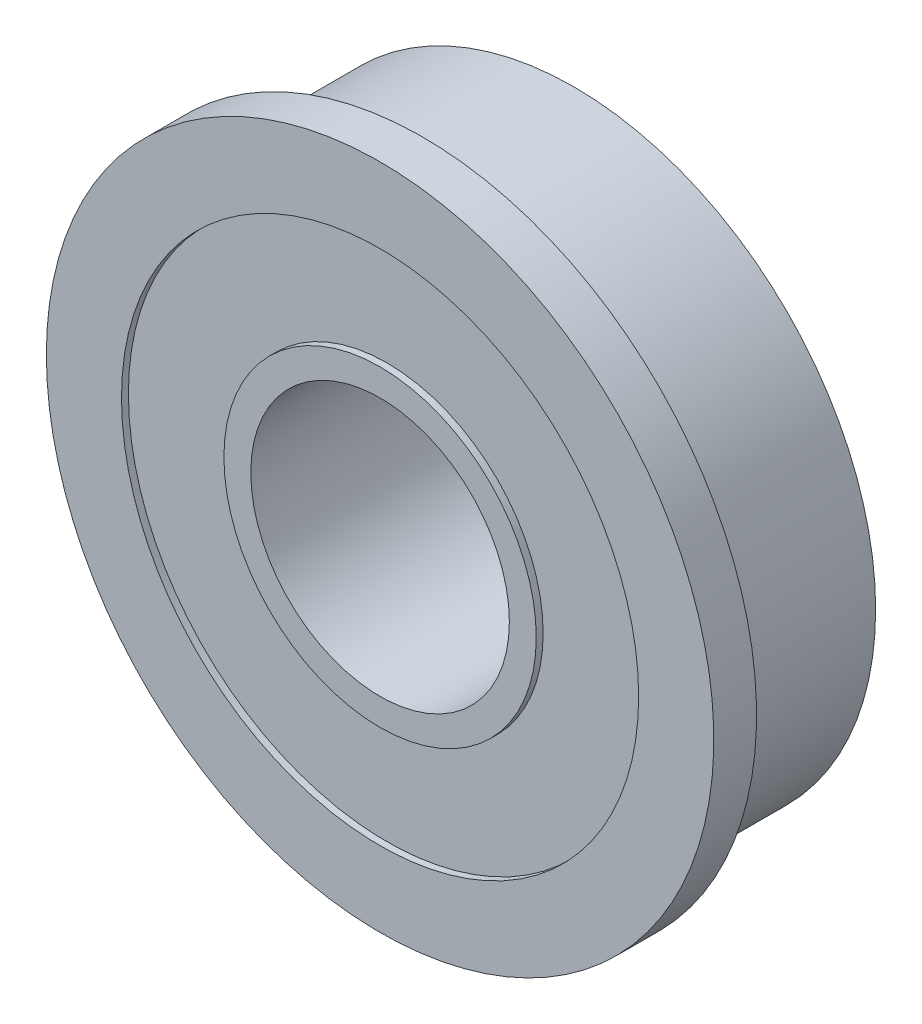
ISO-10303-21;
HEADER;
FILE_DESCRIPTION(('STEP AP214'),'2;1');
FILE_NAME('part.step','',(''),(''),'','','');
FILE_SCHEMA(('AUTOMOTIVE_DESIGN { 1 0 10303 214 1 1 1 1 }'));
ENDSEC;
DATA;
#1=APPLICATION_CONTEXT('core data for automotive mechanical design processes');
#2=APPLICATION_PROTOCOL_DEFINITION('international standard','automotive_design',2000,#1);
#3=PRODUCT_CONTEXT('',#1,'mechanical');
#4=PRODUCT('Part','Part','',(#3));
#5=PRODUCT_RELATED_PRODUCT_CATEGORY('part','',(#4));
#6=PRODUCT_DEFINITION_FORMATION('','',#4);
#7=PRODUCT_DEFINITION_CONTEXT('part definition',#1,'design');
#8=PRODUCT_DEFINITION('design','',#6,#7);
#9=PRODUCT_DEFINITION_SHAPE('','',#8);
#10=(LENGTH_UNIT() NAMED_UNIT(*) SI_UNIT(.MILLI.,.METRE.));
#11=(NAMED_UNIT(*) PLANE_ANGLE_UNIT() SI_UNIT($,.RADIAN.));
#12=(NAMED_UNIT(*) SI_UNIT($,.STERADIAN.) SOLID_ANGLE_UNIT());
#13=UNCERTAINTY_MEASURE_WITH_UNIT(LENGTH_MEASURE(1.E-05),#10,'distance_accuracy_value','');
#14=(GEOMETRIC_REPRESENTATION_CONTEXT(3) GLOBAL_UNCERTAINTY_ASSIGNED_CONTEXT((#13)) GLOBAL_UNIT_ASSIGNED_CONTEXT((#10,
#11,#12)) REPRESENTATION_CONTEXT('',''));
#15=CARTESIAN_POINT('',(0.,0.,0.));
#16=DIRECTION('',(0.,0.,1.));
#17=DIRECTION('',(1.,0.,0.));
#18=AXIS2_PLACEMENT_3D('',#15,#16,#17);
#19=CARTESIAN_POINT('',(4.7625,0.,3.57124));
#20=DIRECTION('',(0.,0.,-1.));
#21=DIRECTION('',(-1.,0.,0.));
#22=AXIS2_PLACEMENT_3D('',#19,#20,#21);
#23=PLANE('',#22);
#24=CARTESIAN_POINT('',(0.,0.,3.57124));
#25=DIRECTION('',(0.,0.,-1.));
#26=DIRECTION('',(-1.,0.,0.));
#27=AXIS2_PLACEMENT_3D('',#24,#25,#26);
#28=CIRCLE('',#27,4.7625);
#29=CARTESIAN_POINT('',(-4.7625,0.,3.57124));
#30=VERTEX_POINT('',#29);
#31=EDGE_CURVE('E57',#30,#30,#28,.T.);
#32=ORIENTED_EDGE('',*,*,#31,.T.);
#33=EDGE_LOOP('',(#32));
#34=FACE_BOUND('',#33,.T.);
#35=CARTESIAN_POINT('',(0.,0.,3.57124));
#36=DIRECTION('',(0.,0.,-1.));
#37=DIRECTION('',(-1.,0.,0.));
#38=AXIS2_PLACEMENT_3D('',#35,#36,#37);
#39=CIRCLE('',#38,5.7531);
#40=CARTESIAN_POINT('',(-5.7531,0.,3.57124));
#41=VERTEX_POINT('',#40);
#42=EDGE_CURVE('E17',#41,#41,#39,.T.);
#43=ORIENTED_EDGE('',*,*,#42,.F.);
#44=EDGE_LOOP('',(#43));
#45=FACE_BOUND('',#44,.T.);
#46=ADVANCED_FACE('F14',(#34,#45),#23,.F.);
#47=CARTESIAN_POINT('',(0.,0.,-3.57124));
#48=DIRECTION('',(0.,0.,-1.));
#49=DIRECTION('',(-1.,0.,0.));
#50=AXIS2_PLACEMENT_3D('',#47,#48,#49);
#51=CYLINDRICAL_SURFACE('',#50,5.7531);
#52=CARTESIAN_POINT('',(0.,0.,3.31724));
#53=DIRECTION('',(0.,0.,-1.));
#54=DIRECTION('',(-1.,0.,0.));
#55=AXIS2_PLACEMENT_3D('',#52,#53,#54);
#56=CIRCLE('',#55,5.7531);
#57=CARTESIAN_POINT('',(-5.7531,0.,3.31724));
#58=VERTEX_POINT('',#57);
#59=EDGE_CURVE('E55',#58,#58,#56,.F.);
#60=ORIENTED_EDGE('',*,*,#59,.T.);
#61=EDGE_LOOP('',(#60));
#62=FACE_BOUND('',#61,.T.);
#63=ORIENTED_EDGE('',*,*,#42,.T.);
#64=EDGE_LOOP('',(#63));
#65=FACE_BOUND('',#64,.T.);
#66=ADVANCED_FACE('F64',(#62,#65),#51,.T.);
#67=CARTESIAN_POINT('',(0.,0.,-3.57124));
#68=DIRECTION('',(0.,0.,-1.));
#69=DIRECTION('',(-1.,0.,0.));
#70=AXIS2_PLACEMENT_3D('',#67,#68,#69);
#71=CYLINDRICAL_SURFACE('',#70,4.7625);
#72=ORIENTED_EDGE('',*,*,#31,.F.);
#73=EDGE_LOOP('',(#72));
#74=FACE_BOUND('',#73,.T.);
#75=CARTESIAN_POINT('',(0.,0.,-3.57124));
#76=DIRECTION('',(0.,0.,-1.));
#77=DIRECTION('',(-1.,0.,0.));
#78=AXIS2_PLACEMENT_3D('',#75,#76,#77);
#79=CIRCLE('',#78,4.7625);
#80=CARTESIAN_POINT('',(-4.7625,0.,-3.57124));
#81=VERTEX_POINT('',#80);
#82=EDGE_CURVE('E52',#81,#81,#79,.T.);
#83=ORIENTED_EDGE('',*,*,#82,.T.);
#84=EDGE_LOOP('',(#83));
#85=FACE_BOUND('',#84,.T.);
#86=ADVANCED_FACE('F71',(#74,#85),#71,.F.);
#87=CARTESIAN_POINT('',(5.7531,0.,3.31724));
#88=DIRECTION('',(0.,0.,-1.));
#89=DIRECTION('',(-1.,0.,0.));
#90=AXIS2_PLACEMENT_3D('',#87,#88,#89);
#91=PLANE('',#90);
#92=ORIENTED_EDGE('',*,*,#59,.F.);
#93=EDGE_LOOP('',(#92));
#94=FACE_BOUND('',#93,.T.);
#95=CARTESIAN_POINT('',(0.,0.,3.31724));
#96=DIRECTION('',(0.,0.,-1.));
#97=DIRECTION('',(-1.,0.,0.));
#98=AXIS2_PLACEMENT_3D('',#95,#96,#97);
#99=CIRCLE('',#98,9.52499999999999);
#100=CARTESIAN_POINT('',(-9.52499999999999,0.,3.31724));
#101=VERTEX_POINT('',#100);
#102=EDGE_CURVE('E49',#101,#101,#99,.F.);
#103=ORIENTED_EDGE('',*,*,#102,.T.);
#104=EDGE_LOOP('',(#103));
#105=FACE_BOUND('',#104,.T.);
#106=ADVANCED_FACE('F115',(#94,#105),#91,.F.);
#107=CARTESIAN_POINT('',(5.7531,0.,-3.57124));
#108=DIRECTION('',(0.,0.,1.));
#109=DIRECTION('',(1.,0.,0.));
#110=AXIS2_PLACEMENT_3D('',#107,#108,#109);
#111=PLANE('',#110);
#112=CARTESIAN_POINT('',(0.,0.,-3.57124));
#113=DIRECTION('',(0.,0.,-1.));
#114=DIRECTION('',(-1.,0.,0.));
#115=AXIS2_PLACEMENT_3D('',#112,#113,#114);
#116=CIRCLE('',#115,5.7531);
#117=CARTESIAN_POINT('',(-5.7531,0.,-3.57124));
#118=VERTEX_POINT('',#117);
#119=EDGE_CURVE('E46',#118,#118,#116,.F.);
#120=ORIENTED_EDGE('',*,*,#119,.F.);
#121=EDGE_LOOP('',(#120));
#122=FACE_BOUND('',#121,.T.);
#123=ORIENTED_EDGE('',*,*,#82,.F.);
#124=EDGE_LOOP('',(#123));
#125=FACE_BOUND('',#124,.T.);
#126=ADVANCED_FACE('F111',(#122,#125),#111,.F.);
#127=CARTESIAN_POINT('',(0.,0.,-3.57124));
#128=DIRECTION('',(0.,0.,-1.));
#129=DIRECTION('',(-1.,0.,0.));
#130=AXIS2_PLACEMENT_3D('',#127,#128,#129);
#131=CYLINDRICAL_SURFACE('',#130,9.52499999999999);
#132=CARTESIAN_POINT('',(0.,0.,3.57124));
#133=DIRECTION('',(0.,0.,-1.));
#134=DIRECTION('',(-1.,0.,0.));
#135=AXIS2_PLACEMENT_3D('',#132,#133,#134);
#136=CIRCLE('',#135,9.52499999999999);
#137=CARTESIAN_POINT('',(-9.52499999999999,0.,3.57124));
#138=VERTEX_POINT('',#137);
#139=EDGE_CURVE('E43',#138,#138,#136,.F.);
#140=ORIENTED_EDGE('',*,*,#139,.T.);
#141=EDGE_LOOP('',(#140));
#142=FACE_BOUND('',#141,.T.);
#143=ORIENTED_EDGE('',*,*,#102,.F.);
#144=EDGE_LOOP('',(#143));
#145=FACE_BOUND('',#144,.T.);
#146=ADVANCED_FACE('F107',(#142,#145),#131,.F.);
#147=CARTESIAN_POINT('',(0.,0.,-3.57124));
#148=DIRECTION('',(0.,0.,-1.));
#149=DIRECTION('',(-1.,0.,0.));
#150=AXIS2_PLACEMENT_3D('',#147,#148,#149);
#151=CYLINDRICAL_SURFACE('',#150,5.7531);
#152=ORIENTED_EDGE('',*,*,#119,.T.);
#153=EDGE_LOOP('',(#152));
#154=FACE_BOUND('',#153,.T.);
#155=CARTESIAN_POINT('',(0.,0.,-3.31724));
#156=DIRECTION('',(0.,0.,-1.));
#157=DIRECTION('',(-1.,0.,0.));
#158=AXIS2_PLACEMENT_3D('',#155,#156,#157);
#159=CIRCLE('',#158,5.7531);
#160=CARTESIAN_POINT('',(-5.7531,0.,-3.31724));
#161=VERTEX_POINT('',#160);
#162=EDGE_CURVE('E40',#161,#161,#159,.T.);
#163=ORIENTED_EDGE('',*,*,#162,.T.);
#164=EDGE_LOOP('',(#163));
#165=FACE_BOUND('',#164,.T.);
#166=ADVANCED_FACE('F103',(#154,#165),#151,.T.);
#167=CARTESIAN_POINT('',(9.52499999999999,0.,3.57124));
#168=DIRECTION('',(0.,0.,-1.));
#169=DIRECTION('',(-1.,0.,0.));
#170=AXIS2_PLACEMENT_3D('',#167,#168,#169);
#171=PLANE('',#170);
#172=ORIENTED_EDGE('',*,*,#139,.F.);
#173=EDGE_LOOP('',(#172));
#174=FACE_BOUND('',#173,.T.);
#175=CARTESIAN_POINT('',(0.,0.,3.57124));
#176=DIRECTION('',(0.,0.,-1.));
#177=DIRECTION('',(-1.,0.,0.));
#178=AXIS2_PLACEMENT_3D('',#175,#176,#177);
#179=CIRCLE('',#178,12.2936);
#180=CARTESIAN_POINT('',(-12.2936,0.,3.57124));
#181=VERTEX_POINT('',#180);
#182=EDGE_CURVE('E37',#181,#181,#179,.T.);
#183=ORIENTED_EDGE('',*,*,#182,.F.);
#184=EDGE_LOOP('',(#183));
#185=FACE_BOUND('',#184,.T.);
#186=ADVANCED_FACE('F99',(#174,#185),#171,.F.);
#187=CARTESIAN_POINT('',(9.52499999999999,0.,-3.31724));
#188=DIRECTION('',(0.,0.,1.));
#189=DIRECTION('',(1.,0.,0.));
#190=AXIS2_PLACEMENT_3D('',#187,#188,#189);
#191=PLANE('',#190);
#192=CARTESIAN_POINT('',(0.,0.,-3.31724));
#193=DIRECTION('',(0.,0.,-1.));
#194=DIRECTION('',(-1.,0.,0.));
#195=AXIS2_PLACEMENT_3D('',#192,#193,#194);
#196=CIRCLE('',#195,9.52499999999999);
#197=CARTESIAN_POINT('',(-9.52499999999999,0.,-3.31724));
#198=VERTEX_POINT('',#197);
#199=EDGE_CURVE('E34',#198,#198,#196,.T.);
#200=ORIENTED_EDGE('',*,*,#199,.T.);
#201=EDGE_LOOP('',(#200));
#202=FACE_BOUND('',#201,.T.);
#203=ORIENTED_EDGE('',*,*,#162,.F.);
#204=EDGE_LOOP('',(#203));
#205=FACE_BOUND('',#204,.T.);
#206=ADVANCED_FACE('F95',(#202,#205),#191,.F.);
#207=CARTESIAN_POINT('',(0.,0.,-3.57124));
#208=DIRECTION('',(0.,0.,-1.));
#209=DIRECTION('',(-1.,0.,0.));
#210=AXIS2_PLACEMENT_3D('',#207,#208,#209);
#211=CYLINDRICAL_SURFACE('',#210,12.2936);
#212=CARTESIAN_POINT('',(0.,0.,1.99644));
#213=DIRECTION('',(0.,0.,-1.));
#214=DIRECTION('',(-1.,0.,0.));
#215=AXIS2_PLACEMENT_3D('',#212,#213,#214);
#216=CIRCLE('',#215,12.2936);
#217=CARTESIAN_POINT('',(-12.2936,0.,1.99644));
#218=VERTEX_POINT('',#217);
#219=EDGE_CURVE('E31',#218,#218,#216,.F.);
#220=ORIENTED_EDGE('',*,*,#219,.T.);
#221=EDGE_LOOP('',(#220));
#222=FACE_BOUND('',#221,.T.);
#223=ORIENTED_EDGE('',*,*,#182,.T.);
#224=EDGE_LOOP('',(#223));
#225=FACE_BOUND('',#224,.T.);
#226=ADVANCED_FACE('F91',(#222,#225),#211,.T.);
#227=CARTESIAN_POINT('',(0.,0.,-3.57124));
#228=DIRECTION('',(0.,0.,-1.));
#229=DIRECTION('',(-1.,0.,0.));
#230=AXIS2_PLACEMENT_3D('',#227,#228,#229);
#231=CYLINDRICAL_SURFACE('',#230,9.52499999999999);
#232=ORIENTED_EDGE('',*,*,#199,.F.);
#233=EDGE_LOOP('',(#232));
#234=FACE_BOUND('',#233,.T.);
#235=CARTESIAN_POINT('',(0.,0.,-3.57124));
#236=DIRECTION('',(0.,0.,-1.));
#237=DIRECTION('',(-1.,0.,0.));
#238=AXIS2_PLACEMENT_3D('',#235,#236,#237);
#239=CIRCLE('',#238,9.52499999999999);
#240=CARTESIAN_POINT('',(-9.52499999999999,0.,-3.57124));
#241=VERTEX_POINT('',#240);
#242=EDGE_CURVE('E26',#241,#241,#239,.T.);
#243=ORIENTED_EDGE('',*,*,#242,.T.);
#244=EDGE_LOOP('',(#243));
#245=FACE_BOUND('',#244,.T.);
#246=ADVANCED_FACE('F87',(#234,#245),#231,.F.);
#247=CARTESIAN_POINT('',(12.2936,0.,1.99644));
#248=DIRECTION('',(0.,0.,1.));
#249=DIRECTION('',(1.,0.,0.));
#250=AXIS2_PLACEMENT_3D('',#247,#248,#249);
#251=PLANE('',#250);
#252=ORIENTED_EDGE('',*,*,#219,.F.);
#253=EDGE_LOOP('',(#252));
#254=FACE_BOUND('',#253,.T.);
#255=CARTESIAN_POINT('',(0.,0.,1.99644));
#256=DIRECTION('',(0.,0.,-1.));
#257=DIRECTION('',(-1.,0.,0.));
#258=AXIS2_PLACEMENT_3D('',#255,#256,#257);
#259=CIRCLE('',#258,11.1125);
#260=CARTESIAN_POINT('',(-11.1125,0.,1.99644));
#261=VERTEX_POINT('',#260);
#262=EDGE_CURVE('E21',#261,#261,#259,.T.);
#263=ORIENTED_EDGE('',*,*,#262,.F.);
#264=EDGE_LOOP('',(#263));
#265=FACE_BOUND('',#264,.T.);
#266=ADVANCED_FACE('F80',(#254,#265),#251,.F.);
#267=CARTESIAN_POINT('',(11.1125,0.,-3.57124));
#268=DIRECTION('',(0.,0.,1.));
#269=DIRECTION('',(1.,0.,0.));
#270=AXIS2_PLACEMENT_3D('',#267,#268,#269);
#271=PLANE('',#270);
#272=CARTESIAN_POINT('',(0.,0.,-3.57124));
#273=DIRECTION('',(0.,0.,-1.));
#274=DIRECTION('',(-1.,0.,0.));
#275=AXIS2_PLACEMENT_3D('',#272,#273,#274);
#276=CIRCLE('',#275,11.1125);
#277=CARTESIAN_POINT('',(-11.1125,0.,-3.57124));
#278=VERTEX_POINT('',#277);
#279=EDGE_CURVE('E9',#278,#278,#276,.F.);
#280=ORIENTED_EDGE('',*,*,#279,.F.);
#281=EDGE_LOOP('',(#280));
#282=FACE_BOUND('',#281,.T.);
#283=ORIENTED_EDGE('',*,*,#242,.F.);
#284=EDGE_LOOP('',(#283));
#285=FACE_BOUND('',#284,.T.);
#286=ADVANCED_FACE('F75',(#282,#285),#271,.F.);
#287=CARTESIAN_POINT('',(0.,0.,-3.57124));
#288=DIRECTION('',(0.,0.,-1.));
#289=DIRECTION('',(-1.,0.,0.));
#290=AXIS2_PLACEMENT_3D('',#287,#288,#289);
#291=CYLINDRICAL_SURFACE('',#290,11.1125);
#292=ORIENTED_EDGE('',*,*,#279,.T.);
#293=EDGE_LOOP('',(#292));
#294=FACE_BOUND('',#293,.T.);
#295=ORIENTED_EDGE('',*,*,#262,.T.);
#296=EDGE_LOOP('',(#295));
#297=FACE_BOUND('',#296,.T.);
#298=ADVANCED_FACE('F73',(#294,#297),#291,.T.);
#299=CLOSED_SHELL('',(#46,#66,#86,#106,#126,#146,#166,#186,#206,#226,#246,#266,#286,#298));
#300=MANIFOLD_SOLID_BREP('B1',#299);
#301=ADVANCED_BREP_SHAPE_REPRESENTATION('',(#18,#300),#14);
#302=SHAPE_DEFINITION_REPRESENTATION(#9,#301);
ENDSEC;
END-ISO-10303-21;
